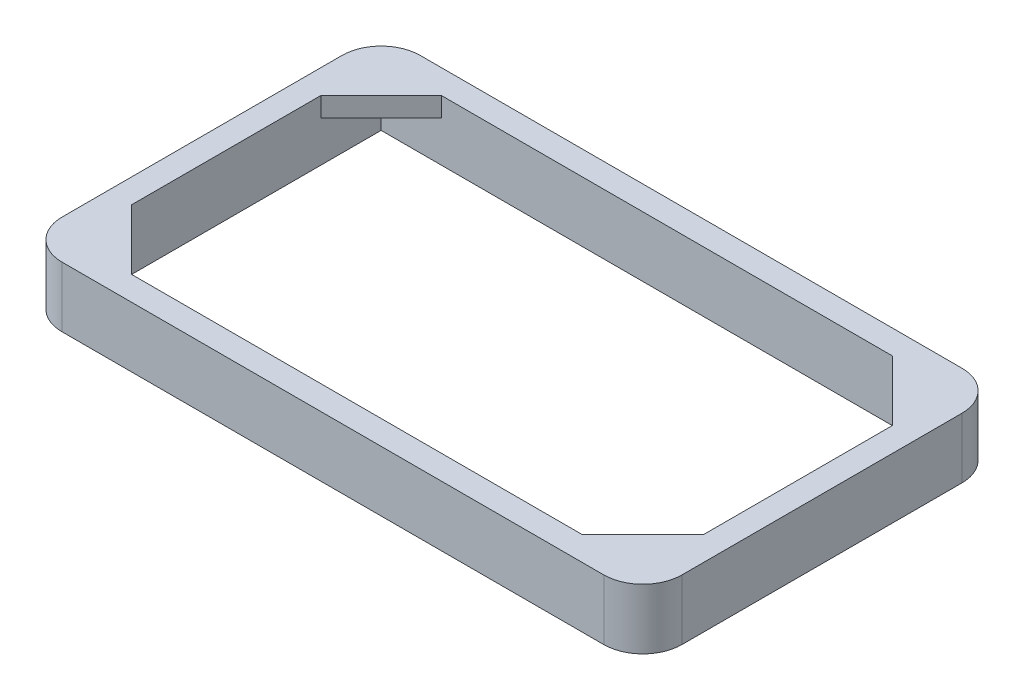
ISO-10303-21;
HEADER;
FILE_DESCRIPTION(('STEP AP214'),'2;1');
FILE_NAME('part.step','',(''),(''),'','','');
FILE_SCHEMA(('AUTOMOTIVE_DESIGN { 1 0 10303 214 1 1 1 1 }'));
ENDSEC;
DATA;
#1=APPLICATION_CONTEXT('core data for automotive mechanical design processes');
#2=APPLICATION_PROTOCOL_DEFINITION('international standard','automotive_design',2000,#1);
#3=PRODUCT_CONTEXT('',#1,'mechanical');
#4=PRODUCT('Part','Part','',(#3));
#5=PRODUCT_RELATED_PRODUCT_CATEGORY('part','',(#4));
#6=PRODUCT_DEFINITION_FORMATION('','',#4);
#7=PRODUCT_DEFINITION_CONTEXT('part definition',#1,'design');
#8=PRODUCT_DEFINITION('design','',#6,#7);
#9=PRODUCT_DEFINITION_SHAPE('','',#8);
#10=(LENGTH_UNIT() NAMED_UNIT(*) SI_UNIT(.MILLI.,.METRE.));
#11=(NAMED_UNIT(*) PLANE_ANGLE_UNIT() SI_UNIT($,.RADIAN.));
#12=(NAMED_UNIT(*) SI_UNIT($,.STERADIAN.) SOLID_ANGLE_UNIT());
#13=UNCERTAINTY_MEASURE_WITH_UNIT(LENGTH_MEASURE(1.E-05),#10,'distance_accuracy_value','');
#14=(GEOMETRIC_REPRESENTATION_CONTEXT(3) GLOBAL_UNCERTAINTY_ASSIGNED_CONTEXT((#13)) GLOBAL_UNIT_ASSIGNED_CONTEXT((#10,
#11,#12)) REPRESENTATION_CONTEXT('',''));
#15=CARTESIAN_POINT('',(0.,0.,0.));
#16=DIRECTION('',(0.,0.,1.));
#17=DIRECTION('',(1.,0.,0.));
#18=AXIS2_PLACEMENT_3D('',#15,#16,#17);
#19=CARTESIAN_POINT('',(0.,0.,0.));
#20=DIRECTION('',(0.,1.,0.));
#21=DIRECTION('',(0.,0.,1.));
#22=AXIS2_PLACEMENT_3D('',#19,#20,#21);
#23=PLANE('',#22);
#24=DIRECTION('',(0.,0.,-1.));
#25=VECTOR('',#24,1.);
#26=CARTESIAN_POINT('',(102.69,0.,-59.325));
#27=LINE('',#26,#25);
#28=CARTESIAN_POINT('',(102.69,0.,46.385));
#29=VERTEX_POINT('',#28);
#30=CARTESIAN_POINT('',(102.69,0.,-46.385));
#31=VERTEX_POINT('',#30);
#32=EDGE_CURVE('E327',#29,#31,#27,.T.);
#33=ORIENTED_EDGE('',*,*,#32,.F.);
#34=CARTESIAN_POINT('',(89.75,0.,46.385));
#35=DIRECTION('',(0.,1.,0.));
#36=DIRECTION('',(0.,0.,1.));
#37=AXIS2_PLACEMENT_3D('',#34,#35,#36);
#38=CIRCLE('',#37,12.94);
#39=CARTESIAN_POINT('',(89.75,0.,59.325));
#40=VERTEX_POINT('',#39);
#41=EDGE_CURVE('E358',#29,#40,#38,.F.);
#42=ORIENTED_EDGE('',*,*,#41,.T.);
#43=DIRECTION('',(1.,0.,0.));
#44=VECTOR('',#43,1.);
#45=CARTESIAN_POINT('',(-102.69,0.,59.325));
#46=LINE('',#45,#44);
#47=CARTESIAN_POINT('',(-89.75,0.,59.325));
#48=VERTEX_POINT('',#47);
#49=EDGE_CURVE('E338',#48,#40,#46,.T.);
#50=ORIENTED_EDGE('',*,*,#49,.F.);
#51=CARTESIAN_POINT('',(-89.75,0.,46.385));
#52=DIRECTION('',(0.,1.,0.));
#53=DIRECTION('',(0.,0.,1.));
#54=AXIS2_PLACEMENT_3D('',#51,#52,#53);
#55=CIRCLE('',#54,12.94);
#56=CARTESIAN_POINT('',(-102.69,0.,46.385));
#57=VERTEX_POINT('',#56);
#58=EDGE_CURVE('E352',#48,#57,#55,.F.);
#59=ORIENTED_EDGE('',*,*,#58,.T.);
#60=DIRECTION('',(0.,0.,1.));
#61=VECTOR('',#60,1.);
#62=CARTESIAN_POINT('',(-102.69,0.,-59.325));
#63=LINE('',#62,#61);
#64=CARTESIAN_POINT('',(-102.69,0.,-46.385));
#65=VERTEX_POINT('',#64);
#66=EDGE_CURVE('E334',#65,#57,#63,.T.);
#67=ORIENTED_EDGE('',*,*,#66,.F.);
#68=CARTESIAN_POINT('',(-89.7500000000001,0.,-46.385));
#69=DIRECTION('',(0.,1.,0.));
#70=DIRECTION('',(0.,0.,1.));
#71=AXIS2_PLACEMENT_3D('',#68,#69,#70);
#72=CIRCLE('',#71,12.94);
#73=CARTESIAN_POINT('',(-89.7500000000001,0.,-59.325));
#74=VERTEX_POINT('',#73);
#75=EDGE_CURVE('E349',#65,#74,#72,.F.);
#76=ORIENTED_EDGE('',*,*,#75,.T.);
#77=DIRECTION('',(-1.,0.,0.));
#78=VECTOR('',#77,1.);
#79=CARTESIAN_POINT('',(-102.69,0.,-59.325));
#80=LINE('',#79,#78);
#81=CARTESIAN_POINT('',(89.75,0.,-59.325));
#82=VERTEX_POINT('',#81);
#83=EDGE_CURVE('E331',#82,#74,#80,.T.);
#84=ORIENTED_EDGE('',*,*,#83,.F.);
#85=CARTESIAN_POINT('',(89.75,0.,-46.385));
#86=DIRECTION('',(0.,1.,0.));
#87=DIRECTION('',(0.,0.,1.));
#88=AXIS2_PLACEMENT_3D('',#85,#86,#87);
#89=CIRCLE('',#88,12.94);
#90=EDGE_CURVE('E355',#82,#31,#89,.F.);
#91=ORIENTED_EDGE('',*,*,#90,.T.);
#92=EDGE_LOOP('',(#33,#42,#50,#59,#67,#76,#84,#91));
#93=FACE_BOUND('',#92,.T.);
#94=DIRECTION('',(0.,0.,1.));
#95=VECTOR('',#94,1.);
#96=CARTESIAN_POINT('',(-94.69,0.,-51.325));
#97=LINE('',#96,#95);
#98=CARTESIAN_POINT('',(-94.69,0.,-51.325));
#99=VERTEX_POINT('',#98);
#100=CARTESIAN_POINT('',(-94.69,0.,51.325));
#101=VERTEX_POINT('',#100);
#102=EDGE_CURVE('E278',#99,#101,#97,.T.);
#103=ORIENTED_EDGE('',*,*,#102,.T.);
#104=DIRECTION('',(1.,0.,0.));
#105=VECTOR('',#104,1.);
#106=CARTESIAN_POINT('',(94.69,0.,51.325));
#107=LINE('',#106,#105);
#108=CARTESIAN_POINT('',(94.69,0.,51.325));
#109=VERTEX_POINT('',#108);
#110=EDGE_CURVE('E302',#101,#109,#107,.T.);
#111=ORIENTED_EDGE('',*,*,#110,.T.);
#112=DIRECTION('',(0.,0.,-1.));
#113=VECTOR('',#112,1.);
#114=CARTESIAN_POINT('',(94.69,0.,-51.325));
#115=LINE('',#114,#113);
#116=CARTESIAN_POINT('',(94.69,0.,-51.325));
#117=VERTEX_POINT('',#116);
#118=EDGE_CURVE('E306',#109,#117,#115,.T.);
#119=ORIENTED_EDGE('',*,*,#118,.T.);
#120=DIRECTION('',(-1.,0.,0.));
#121=VECTOR('',#120,1.);
#122=CARTESIAN_POINT('',(94.69,0.,-51.325));
#123=LINE('',#122,#121);
#124=EDGE_CURVE('E310',#117,#99,#123,.T.);
#125=ORIENTED_EDGE('',*,*,#124,.T.);
#126=EDGE_LOOP('',(#103,#111,#119,#125));
#127=FACE_BOUND('',#126,.T.);
#128=ADVANCED_FACE('F39',(#93,#127),#23,.F.);
#129=CARTESIAN_POINT('',(102.69,13.5,-59.325));
#130=DIRECTION('',(-1.,0.,0.));
#131=DIRECTION('',(0.,0.,1.));
#132=AXIS2_PLACEMENT_3D('',#129,#130,#131);
#133=PLANE('',#132);
#134=DIRECTION('',(0.,0.,-1.));
#135=VECTOR('',#134,1.);
#136=CARTESIAN_POINT('',(102.69,20.,-59.325));
#137=LINE('',#136,#135);
#138=CARTESIAN_POINT('',(102.69,20.,46.385));
#139=VERTEX_POINT('',#138);
#140=CARTESIAN_POINT('',(102.69,20.,-46.385));
#141=VERTEX_POINT('',#140);
#142=EDGE_CURVE('E272',#139,#141,#137,.T.);
#143=ORIENTED_EDGE('',*,*,#142,.F.);
#144=DIRECTION('',(0.,-1.,0.));
#145=VECTOR('',#144,1.);
#146=CARTESIAN_POINT('',(102.69,13.5,46.385));
#147=LINE('',#146,#145);
#148=EDGE_CURVE('E345',#139,#29,#147,.T.);
#149=ORIENTED_EDGE('',*,*,#148,.T.);
#150=ORIENTED_EDGE('',*,*,#32,.T.);
#151=DIRECTION('',(0.,-1.,0.));
#152=VECTOR('',#151,1.);
#153=CARTESIAN_POINT('',(102.69,13.5,-46.385));
#154=LINE('',#153,#152);
#155=EDGE_CURVE('E342',#31,#141,#154,.F.);
#156=ORIENTED_EDGE('',*,*,#155,.T.);
#157=EDGE_LOOP('',(#143,#149,#150,#156));
#158=FACE_BOUND('',#157,.T.);
#159=ADVANCED_FACE('F413',(#158),#133,.F.);
#160=CARTESIAN_POINT('',(-102.69,13.5,-59.325));
#161=DIRECTION('',(0.,0.,1.));
#162=DIRECTION('',(1.,0.,0.));
#163=AXIS2_PLACEMENT_3D('',#160,#161,#162);
#164=PLANE('',#163);
#165=DIRECTION('',(-1.,0.,0.));
#166=VECTOR('',#165,1.);
#167=CARTESIAN_POINT('',(-102.69,20.,-59.325));
#168=LINE('',#167,#166);
#169=CARTESIAN_POINT('',(89.75,20.,-59.325));
#170=VERTEX_POINT('',#169);
#171=CARTESIAN_POINT('',(-89.7500000000001,20.,-59.325));
#172=VERTEX_POINT('',#171);
#173=EDGE_CURVE('E275',#170,#172,#168,.T.);
#174=ORIENTED_EDGE('',*,*,#173,.F.);
#175=DIRECTION('',(0.,-1.,0.));
#176=VECTOR('',#175,1.);
#177=CARTESIAN_POINT('',(89.75,13.5,-59.325));
#178=LINE('',#177,#176);
#179=EDGE_CURVE('E381',#170,#82,#178,.T.);
#180=ORIENTED_EDGE('',*,*,#179,.T.);
#181=ORIENTED_EDGE('',*,*,#83,.T.);
#182=DIRECTION('',(0.,-1.,0.));
#183=VECTOR('',#182,1.);
#184=CARTESIAN_POINT('',(-89.7500000000001,13.5,-59.325));
#185=LINE('',#184,#183);
#186=EDGE_CURVE('E55',#74,#172,#185,.F.);
#187=ORIENTED_EDGE('',*,*,#186,.T.);
#188=EDGE_LOOP('',(#174,#180,#181,#187));
#189=FACE_BOUND('',#188,.T.);
#190=ADVANCED_FACE('F418',(#189),#164,.F.);
#191=CARTESIAN_POINT('',(-102.69,13.5,-59.325));
#192=DIRECTION('',(1.,0.,0.));
#193=DIRECTION('',(0.,0.,-1.));
#194=AXIS2_PLACEMENT_3D('',#191,#192,#193);
#195=PLANE('',#194);
#196=ORIENTED_EDGE('',*,*,#66,.T.);
#197=DIRECTION('',(0.,-1.,0.));
#198=VECTOR('',#197,1.);
#199=CARTESIAN_POINT('',(-102.69,13.5,46.385));
#200=LINE('',#199,#198);
#201=CARTESIAN_POINT('',(-102.69,20.,46.385));
#202=VERTEX_POINT('',#201);
#203=EDGE_CURVE('E11',#57,#202,#200,.F.);
#204=ORIENTED_EDGE('',*,*,#203,.T.);
#205=DIRECTION('',(0.,0.,1.));
#206=VECTOR('',#205,1.);
#207=CARTESIAN_POINT('',(-102.69,20.,-59.325));
#208=LINE('',#207,#206);
#209=CARTESIAN_POINT('',(-102.69,20.,-46.385));
#210=VERTEX_POINT('',#209);
#211=EDGE_CURVE('E200',#210,#202,#208,.T.);
#212=ORIENTED_EDGE('',*,*,#211,.F.);
#213=DIRECTION('',(0.,-1.,0.));
#214=VECTOR('',#213,1.);
#215=CARTESIAN_POINT('',(-102.69,13.5,-46.385));
#216=LINE('',#215,#214);
#217=EDGE_CURVE('E48',#210,#65,#216,.T.);
#218=ORIENTED_EDGE('',*,*,#217,.T.);
#219=EDGE_LOOP('',(#196,#204,#212,#218));
#220=FACE_BOUND('',#219,.T.);
#221=ADVANCED_FACE('F390',(#220),#195,.F.);
#222=CARTESIAN_POINT('',(-102.69,13.5,59.325));
#223=DIRECTION('',(0.,0.,-1.));
#224=DIRECTION('',(-1.,0.,0.));
#225=AXIS2_PLACEMENT_3D('',#222,#223,#224);
#226=PLANE('',#225);
#227=ORIENTED_EDGE('',*,*,#49,.T.);
#228=DIRECTION('',(0.,-1.,0.));
#229=VECTOR('',#228,1.);
#230=CARTESIAN_POINT('',(89.75,13.5,59.325));
#231=LINE('',#230,#229);
#232=CARTESIAN_POINT('',(89.75,20.,59.325));
#233=VERTEX_POINT('',#232);
#234=EDGE_CURVE('E365',#40,#233,#231,.F.);
#235=ORIENTED_EDGE('',*,*,#234,.T.);
#236=DIRECTION('',(1.,0.,0.));
#237=VECTOR('',#236,1.);
#238=CARTESIAN_POINT('',(-102.69,20.,59.325));
#239=LINE('',#238,#237);
#240=CARTESIAN_POINT('',(-89.75,20.,59.325));
#241=VERTEX_POINT('',#240);
#242=EDGE_CURVE('E268',#241,#233,#239,.T.);
#243=ORIENTED_EDGE('',*,*,#242,.F.);
#244=DIRECTION('',(0.,-1.,0.));
#245=VECTOR('',#244,1.);
#246=CARTESIAN_POINT('',(-89.75,13.5,59.325));
#247=LINE('',#246,#245);
#248=EDGE_CURVE('E361',#241,#48,#247,.T.);
#249=ORIENTED_EDGE('',*,*,#248,.T.);
#250=EDGE_LOOP('',(#227,#235,#243,#249));
#251=FACE_BOUND('',#250,.T.);
#252=ADVANCED_FACE('F405',(#251),#226,.F.);
#253=CARTESIAN_POINT('',(-94.69,13.5,-51.325));
#254=DIRECTION('',(1.,0.,0.));
#255=DIRECTION('',(0.,0.,-1.));
#256=AXIS2_PLACEMENT_3D('',#253,#254,#255);
#257=PLANE('',#256);
#258=ORIENTED_EDGE('',*,*,#102,.F.);
#259=DIRECTION('',(0.,-1.,0.));
#260=VECTOR('',#259,1.);
#261=CARTESIAN_POINT('',(-94.69,13.5,-51.325));
#262=LINE('',#261,#260);
#263=CARTESIAN_POINT('',(-94.69,13.5,-51.325));
#264=VERTEX_POINT('',#263);
#265=EDGE_CURVE('E298',#264,#99,#262,.T.);
#266=ORIENTED_EDGE('',*,*,#265,.F.);
#267=DIRECTION('',(0.,0.,1.));
#268=VECTOR('',#267,1.);
#269=CARTESIAN_POINT('',(-94.69,13.5,-51.325));
#270=LINE('',#269,#268);
#271=CARTESIAN_POINT('',(-94.69,13.5,-31.325));
#272=VERTEX_POINT('',#271);
#273=EDGE_CURVE('E279',#264,#272,#270,.T.);
#274=ORIENTED_EDGE('',*,*,#273,.T.);
#275=DIRECTION('',(0.,-1.,0.));
#276=VECTOR('',#275,1.);
#277=CARTESIAN_POINT('',(-94.69,20.,-31.325));
#278=LINE('',#277,#276);
#279=CARTESIAN_POINT('',(-94.69,20.,-31.325));
#280=VERTEX_POINT('',#279);
#281=EDGE_CURVE('E185',#280,#272,#278,.T.);
#282=ORIENTED_EDGE('',*,*,#281,.F.);
#283=DIRECTION('',(0.,0.,1.));
#284=VECTOR('',#283,1.);
#285=CARTESIAN_POINT('',(-94.69,20.,-31.325));
#286=LINE('',#285,#284);
#287=CARTESIAN_POINT('',(-94.69,20.,31.325));
#288=VERTEX_POINT('',#287);
#289=EDGE_CURVE('E179',#280,#288,#286,.T.);
#290=ORIENTED_EDGE('',*,*,#289,.T.);
#291=DIRECTION('',(0.,-1.,0.));
#292=VECTOR('',#291,1.);
#293=CARTESIAN_POINT('',(-94.69,20.,31.325));
#294=LINE('',#293,#292);
#295=CARTESIAN_POINT('',(-94.69,13.5,31.325));
#296=VERTEX_POINT('',#295);
#297=EDGE_CURVE('E183',#288,#296,#294,.T.);
#298=ORIENTED_EDGE('',*,*,#297,.T.);
#299=CARTESIAN_POINT('',(-94.69,13.5,51.325));
#300=VERTEX_POINT('',#299);
#301=EDGE_CURVE('E283',#296,#300,#270,.T.);
#302=ORIENTED_EDGE('',*,*,#301,.T.);
#303=DIRECTION('',(0.,-1.,0.));
#304=VECTOR('',#303,1.);
#305=CARTESIAN_POINT('',(-94.69,13.5,51.325));
#306=LINE('',#305,#304);
#307=EDGE_CURVE('E323',#300,#101,#306,.T.);
#308=ORIENTED_EDGE('',*,*,#307,.T.);
#309=EDGE_LOOP('',(#258,#266,#274,#282,#290,#298,#302,#308));
#310=FACE_BOUND('',#309,.T.);
#311=ADVANCED_FACE('F181',(#310),#257,.T.);
#312=CARTESIAN_POINT('',(94.69,13.5,51.325));
#313=DIRECTION('',(0.,0.,-1.));
#314=DIRECTION('',(-1.,0.,0.));
#315=AXIS2_PLACEMENT_3D('',#312,#313,#314);
#316=PLANE('',#315);
#317=ORIENTED_EDGE('',*,*,#110,.F.);
#318=ORIENTED_EDGE('',*,*,#307,.F.);
#319=DIRECTION('',(1.,0.,0.));
#320=VECTOR('',#319,1.);
#321=CARTESIAN_POINT('',(94.69,13.5,51.325));
#322=LINE('',#321,#320);
#323=CARTESIAN_POINT('',(-74.69,13.5,51.325));
#324=VERTEX_POINT('',#323);
#325=EDGE_CURVE('E284',#300,#324,#322,.T.);
#326=ORIENTED_EDGE('',*,*,#325,.T.);
#327=DIRECTION('',(0.,-1.,0.));
#328=VECTOR('',#327,1.);
#329=CARTESIAN_POINT('',(-74.69,20.,51.325));
#330=LINE('',#329,#328);
#331=CARTESIAN_POINT('',(-74.69,20.,51.325));
#332=VERTEX_POINT('',#331);
#333=EDGE_CURVE('E201',#332,#324,#330,.T.);
#334=ORIENTED_EDGE('',*,*,#333,.F.);
#335=DIRECTION('',(1.,0.,0.));
#336=VECTOR('',#335,1.);
#337=CARTESIAN_POINT('',(-74.69,20.,51.325));
#338=LINE('',#337,#336);
#339=CARTESIAN_POINT('',(74.69,20.,51.325));
#340=VERTEX_POINT('',#339);
#341=EDGE_CURVE('E206',#332,#340,#338,.T.);
#342=ORIENTED_EDGE('',*,*,#341,.T.);
#343=DIRECTION('',(0.,-1.,0.));
#344=VECTOR('',#343,1.);
#345=CARTESIAN_POINT('',(74.69,20.,51.325));
#346=LINE('',#345,#344);
#347=CARTESIAN_POINT('',(74.69,13.5,51.325));
#348=VERTEX_POINT('',#347);
#349=EDGE_CURVE('E259',#340,#348,#346,.T.);
#350=ORIENTED_EDGE('',*,*,#349,.T.);
#351=CARTESIAN_POINT('',(94.69,13.5,51.325));
#352=VERTEX_POINT('',#351);
#353=EDGE_CURVE('E282',#348,#352,#322,.T.);
#354=ORIENTED_EDGE('',*,*,#353,.T.);
#355=DIRECTION('',(0.,-1.,0.));
#356=VECTOR('',#355,1.);
#357=CARTESIAN_POINT('',(94.69,13.5,51.325));
#358=LINE('',#357,#356);
#359=EDGE_CURVE('E320',#352,#109,#358,.T.);
#360=ORIENTED_EDGE('',*,*,#359,.T.);
#361=EDGE_LOOP('',(#317,#318,#326,#334,#342,#350,#354,#360));
#362=FACE_BOUND('',#361,.T.);
#363=ADVANCED_FACE('F631',(#362),#316,.T.);
#364=CARTESIAN_POINT('',(94.69,13.5,-51.325));
#365=DIRECTION('',(-1.,0.,0.));
#366=DIRECTION('',(0.,0.,1.));
#367=AXIS2_PLACEMENT_3D('',#364,#365,#366);
#368=PLANE('',#367);
#369=ORIENTED_EDGE('',*,*,#118,.F.);
#370=ORIENTED_EDGE('',*,*,#359,.F.);
#371=DIRECTION('',(0.,0.,-1.));
#372=VECTOR('',#371,1.);
#373=CARTESIAN_POINT('',(94.69,13.5,-51.325));
#374=LINE('',#373,#372);
#375=CARTESIAN_POINT('',(94.69,13.5,31.325));
#376=VERTEX_POINT('',#375);
#377=EDGE_CURVE('E289',#352,#376,#374,.T.);
#378=ORIENTED_EDGE('',*,*,#377,.T.);
#379=DIRECTION('',(0.,-1.,0.));
#380=VECTOR('',#379,1.);
#381=CARTESIAN_POINT('',(94.69,20.,31.325));
#382=LINE('',#381,#380);
#383=CARTESIAN_POINT('',(94.69,20.,31.325));
#384=VERTEX_POINT('',#383);
#385=EDGE_CURVE('E256',#384,#376,#382,.T.);
#386=ORIENTED_EDGE('',*,*,#385,.F.);
#387=DIRECTION('',(0.,0.,-1.));
#388=VECTOR('',#387,1.);
#389=CARTESIAN_POINT('',(94.69,20.,-31.3249999999999));
#390=LINE('',#389,#388);
#391=CARTESIAN_POINT('',(94.69,20.,-31.3249999999999));
#392=VERTEX_POINT('',#391);
#393=EDGE_CURVE('E216',#384,#392,#390,.T.);
#394=ORIENTED_EDGE('',*,*,#393,.T.);
#395=DIRECTION('',(0.,-1.,0.));
#396=VECTOR('',#395,1.);
#397=CARTESIAN_POINT('',(94.69,20.,-31.3249999999999));
#398=LINE('',#397,#396);
#399=CARTESIAN_POINT('',(94.69,13.5,-31.3249999999999));
#400=VERTEX_POINT('',#399);
#401=EDGE_CURVE('E252',#392,#400,#398,.T.);
#402=ORIENTED_EDGE('',*,*,#401,.T.);
#403=CARTESIAN_POINT('',(94.69,13.5,-51.325));
#404=VERTEX_POINT('',#403);
#405=EDGE_CURVE('E288',#400,#404,#374,.T.);
#406=ORIENTED_EDGE('',*,*,#405,.T.);
#407=DIRECTION('',(0.,-1.,0.));
#408=VECTOR('',#407,1.);
#409=CARTESIAN_POINT('',(94.69,13.5,-51.325));
#410=LINE('',#409,#408);
#411=EDGE_CURVE('E317',#404,#117,#410,.T.);
#412=ORIENTED_EDGE('',*,*,#411,.T.);
#413=EDGE_LOOP('',(#369,#370,#378,#386,#394,#402,#406,#412));
#414=FACE_BOUND('',#413,.T.);
#415=ADVANCED_FACE('F618',(#414),#368,.T.);
#416=CARTESIAN_POINT('',(94.69,13.5,-51.325));
#417=DIRECTION('',(0.,0.,1.));
#418=DIRECTION('',(1.,0.,0.));
#419=AXIS2_PLACEMENT_3D('',#416,#417,#418);
#420=PLANE('',#419);
#421=ORIENTED_EDGE('',*,*,#124,.F.);
#422=ORIENTED_EDGE('',*,*,#411,.F.);
#423=DIRECTION('',(-1.,0.,0.));
#424=VECTOR('',#423,1.);
#425=CARTESIAN_POINT('',(94.69,13.5,-51.325));
#426=LINE('',#425,#424);
#427=CARTESIAN_POINT('',(74.69,13.5,-51.325));
#428=VERTEX_POINT('',#427);
#429=EDGE_CURVE('E294',#404,#428,#426,.T.);
#430=ORIENTED_EDGE('',*,*,#429,.T.);
#431=DIRECTION('',(0.,-1.,0.));
#432=VECTOR('',#431,1.);
#433=CARTESIAN_POINT('',(74.69,20.,-51.325));
#434=LINE('',#433,#432);
#435=CARTESIAN_POINT('',(74.69,20.,-51.325));
#436=VERTEX_POINT('',#435);
#437=EDGE_CURVE('E249',#436,#428,#434,.T.);
#438=ORIENTED_EDGE('',*,*,#437,.F.);
#439=DIRECTION('',(-1.,0.,0.));
#440=VECTOR('',#439,1.);
#441=CARTESIAN_POINT('',(-74.69,20.,-51.325));
#442=LINE('',#441,#440);
#443=CARTESIAN_POINT('',(-74.69,20.,-51.325));
#444=VERTEX_POINT('',#443);
#445=EDGE_CURVE('E222',#436,#444,#442,.T.);
#446=ORIENTED_EDGE('',*,*,#445,.T.);
#447=DIRECTION('',(0.,-1.,0.));
#448=VECTOR('',#447,1.);
#449=CARTESIAN_POINT('',(-74.69,20.,-51.325));
#450=LINE('',#449,#448);
#451=CARTESIAN_POINT('',(-74.69,13.5,-51.325));
#452=VERTEX_POINT('',#451);
#453=EDGE_CURVE('E245',#444,#452,#450,.T.);
#454=ORIENTED_EDGE('',*,*,#453,.T.);
#455=EDGE_CURVE('E293',#452,#264,#426,.T.);
#456=ORIENTED_EDGE('',*,*,#455,.T.);
#457=ORIENTED_EDGE('',*,*,#265,.T.);
#458=EDGE_LOOP('',(#421,#422,#430,#438,#446,#454,#456,#457));
#459=FACE_BOUND('',#458,.T.);
#460=ADVANCED_FACE('F610',(#459),#420,.T.);
#461=CARTESIAN_POINT('',(0.,13.5,0.));
#462=DIRECTION('',(0.,1.,0.));
#463=DIRECTION('',(0.,0.,1.));
#464=AXIS2_PLACEMENT_3D('',#461,#462,#463);
#465=PLANE('',#464);
#466=CARTESIAN_POINT('',(-88.94,13.5,45.575));
#467=DIRECTION('',(0.,-1.,0.));
#468=DIRECTION('',(0.,0.,-1.));
#469=AXIS2_PLACEMENT_3D('',#466,#467,#468);
#470=CIRCLE('',#469,2.5);
#471=CARTESIAN_POINT('',(-88.94,13.5,43.075));
#472=VERTEX_POINT('',#471);
#473=EDGE_CURVE('E743',#472,#472,#470,.T.);
#474=ORIENTED_EDGE('',*,*,#473,.F.);
#475=EDGE_LOOP('',(#474));
#476=FACE_BOUND('',#475,.T.);
#477=ORIENTED_EDGE('',*,*,#325,.F.);
#478=ORIENTED_EDGE('',*,*,#301,.F.);
#479=DIRECTION('',(0.707106781186548,0.,0.707106781186547));
#480=VECTOR('',#479,1.);
#481=CARTESIAN_POINT('',(-94.69,13.5,31.325));
#482=LINE('',#481,#480);
#483=EDGE_CURVE('E198',#296,#324,#482,.T.);
#484=ORIENTED_EDGE('',*,*,#483,.T.);
#485=EDGE_LOOP('',(#477,#478,#484));
#486=FACE_BOUND('',#485,.T.);
#487=ADVANCED_FACE('F581',(#476,#486),#465,.F.);
#488=CARTESIAN_POINT('',(-88.94,13.5,-45.575));
#489=DIRECTION('',(0.,-1.,0.));
#490=DIRECTION('',(0.,0.,1.));
#491=AXIS2_PLACEMENT_3D('',#488,#489,#490);
#492=CIRCLE('',#491,2.5);
#493=CARTESIAN_POINT('',(-88.94,13.5,-43.075));
#494=VERTEX_POINT('',#493);
#495=EDGE_CURVE('E755',#494,#494,#492,.T.);
#496=ORIENTED_EDGE('',*,*,#495,.F.);
#497=EDGE_LOOP('',(#496));
#498=FACE_BOUND('',#497,.T.);
#499=ORIENTED_EDGE('',*,*,#273,.F.);
#500=ORIENTED_EDGE('',*,*,#455,.F.);
#501=DIRECTION('',(-0.707106781186548,0.,0.707106781186547));
#502=VECTOR('',#501,1.);
#503=CARTESIAN_POINT('',(-94.69,13.5,-31.325));
#504=LINE('',#503,#502);
#505=EDGE_CURVE('E191',#452,#272,#504,.T.);
#506=ORIENTED_EDGE('',*,*,#505,.T.);
#507=EDGE_LOOP('',(#499,#500,#506));
#508=FACE_BOUND('',#507,.T.);
#509=ADVANCED_FACE('F596',(#498,#508),#465,.F.);
#510=CARTESIAN_POINT('',(88.94,13.5,45.575));
#511=DIRECTION('',(0.,-1.,0.));
#512=DIRECTION('',(0.,0.,1.));
#513=AXIS2_PLACEMENT_3D('',#510,#511,#512);
#514=CIRCLE('',#513,2.5);
#515=CARTESIAN_POINT('',(88.94,13.5,48.075));
#516=VERTEX_POINT('',#515);
#517=EDGE_CURVE('E752',#516,#516,#514,.T.);
#518=ORIENTED_EDGE('',*,*,#517,.F.);
#519=EDGE_LOOP('',(#518));
#520=FACE_BOUND('',#519,.T.);
#521=ORIENTED_EDGE('',*,*,#353,.F.);
#522=DIRECTION('',(0.707106781186548,0.,-0.707106781186548));
#523=VECTOR('',#522,1.);
#524=CARTESIAN_POINT('',(94.69,13.5,31.325));
#525=LINE('',#524,#523);
#526=EDGE_CURVE('E231',#348,#376,#525,.T.);
#527=ORIENTED_EDGE('',*,*,#526,.T.);
#528=ORIENTED_EDGE('',*,*,#377,.F.);
#529=EDGE_LOOP('',(#521,#527,#528));
#530=FACE_BOUND('',#529,.T.);
#531=ADVANCED_FACE('F582',(#520,#530),#465,.F.);
#532=CARTESIAN_POINT('',(0.,20.,0.));
#533=DIRECTION('',(0.,1.,0.));
#534=DIRECTION('',(0.,0.,1.));
#535=AXIS2_PLACEMENT_3D('',#532,#533,#534);
#536=PLANE('',#535);
#537=ORIENTED_EDGE('',*,*,#242,.T.);
#538=CARTESIAN_POINT('',(89.75,20.,46.385));
#539=DIRECTION('',(0.,1.,0.));
#540=DIRECTION('',(0.,0.,1.));
#541=AXIS2_PLACEMENT_3D('',#538,#539,#540);
#542=CIRCLE('',#541,12.94);
#543=EDGE_CURVE('E376',#233,#139,#542,.T.);
#544=ORIENTED_EDGE('',*,*,#543,.T.);
#545=ORIENTED_EDGE('',*,*,#142,.T.);
#546=CARTESIAN_POINT('',(89.75,20.,-46.385));
#547=DIRECTION('',(0.,1.,0.));
#548=DIRECTION('',(0.,0.,1.));
#549=AXIS2_PLACEMENT_3D('',#546,#547,#548);
#550=CIRCLE('',#549,12.94);
#551=EDGE_CURVE('E62',#141,#170,#550,.T.);
#552=ORIENTED_EDGE('',*,*,#551,.T.);
#553=ORIENTED_EDGE('',*,*,#173,.T.);
#554=CARTESIAN_POINT('',(-89.7500000000001,20.,-46.385));
#555=DIRECTION('',(0.,1.,0.));
#556=DIRECTION('',(0.,0.,1.));
#557=AXIS2_PLACEMENT_3D('',#554,#555,#556);
#558=CIRCLE('',#557,12.94);
#559=EDGE_CURVE('E368',#172,#210,#558,.T.);
#560=ORIENTED_EDGE('',*,*,#559,.T.);
#561=ORIENTED_EDGE('',*,*,#211,.T.);
#562=CARTESIAN_POINT('',(-89.75,20.,46.385));
#563=DIRECTION('',(0.,1.,0.));
#564=DIRECTION('',(0.,0.,1.));
#565=AXIS2_PLACEMENT_3D('',#562,#563,#564);
#566=CIRCLE('',#565,12.94);
#567=EDGE_CURVE('E371',#202,#241,#566,.T.);
#568=ORIENTED_EDGE('',*,*,#567,.T.);
#569=EDGE_LOOP('',(#537,#544,#545,#552,#553,#560,#561,#568));
#570=FACE_BOUND('',#569,.T.);
#571=DIRECTION('',(0.707106781186548,0.,0.707106781186547));
#572=VECTOR('',#571,1.);
#573=CARTESIAN_POINT('',(-94.69,20.,31.325));
#574=LINE('',#573,#572);
#575=EDGE_CURVE('E190',#288,#332,#574,.T.);
#576=ORIENTED_EDGE('',*,*,#575,.F.);
#577=ORIENTED_EDGE('',*,*,#289,.F.);
#578=DIRECTION('',(-0.707106781186548,0.,0.707106781186547));
#579=VECTOR('',#578,1.);
#580=CARTESIAN_POINT('',(-94.69,20.,-31.325));
#581=LINE('',#580,#579);
#582=EDGE_CURVE('E226',#444,#280,#581,.T.);
#583=ORIENTED_EDGE('',*,*,#582,.F.);
#584=ORIENTED_EDGE('',*,*,#445,.F.);
#585=DIRECTION('',(-0.707106781186548,0.,-0.707106781186548));
#586=VECTOR('',#585,1.);
#587=CARTESIAN_POINT('',(94.69,20.,-31.3249999999999));
#588=LINE('',#587,#586);
#589=EDGE_CURVE('E219',#392,#436,#588,.T.);
#590=ORIENTED_EDGE('',*,*,#589,.F.);
#591=ORIENTED_EDGE('',*,*,#393,.F.);
#592=DIRECTION('',(0.707106781186548,0.,-0.707106781186548));
#593=VECTOR('',#592,1.);
#594=CARTESIAN_POINT('',(94.69,20.,31.325));
#595=LINE('',#594,#593);
#596=EDGE_CURVE('E210',#340,#384,#595,.T.);
#597=ORIENTED_EDGE('',*,*,#596,.F.);
#598=ORIENTED_EDGE('',*,*,#341,.F.);
#599=EDGE_LOOP('',(#576,#577,#583,#584,#590,#591,#597,#598));
#600=FACE_BOUND('',#599,.T.);
#601=ADVANCED_FACE('F204',(#570,#600),#536,.T.);
#602=CARTESIAN_POINT('',(88.94,13.5,-45.575));
#603=DIRECTION('',(0.,-1.,0.));
#604=DIRECTION('',(0.,0.,-1.));
#605=AXIS2_PLACEMENT_3D('',#602,#603,#604);
#606=CIRCLE('',#605,2.5);
#607=CARTESIAN_POINT('',(88.94,13.5,-48.075));
#608=VERTEX_POINT('',#607);
#609=EDGE_CURVE('E763',#608,#608,#606,.T.);
#610=ORIENTED_EDGE('',*,*,#609,.F.);
#611=EDGE_LOOP('',(#610));
#612=FACE_BOUND('',#611,.T.);
#613=ORIENTED_EDGE('',*,*,#429,.F.);
#614=ORIENTED_EDGE('',*,*,#405,.F.);
#615=DIRECTION('',(-0.707106781186548,0.,-0.707106781186548));
#616=VECTOR('',#615,1.);
#617=CARTESIAN_POINT('',(94.69,13.5,-31.3249999999999));
#618=LINE('',#617,#616);
#619=EDGE_CURVE('E236',#400,#428,#618,.T.);
#620=ORIENTED_EDGE('',*,*,#619,.T.);
#621=EDGE_LOOP('',(#613,#614,#620));
#622=FACE_BOUND('',#621,.T.);
#623=ADVANCED_FACE('F571',(#612,#622),#465,.F.);
#624=CARTESIAN_POINT('',(-94.69,20.,31.325));
#625=DIRECTION('',(0.707106781186547,0.,-0.707106781186548));
#626=DIRECTION('',(-0.707106781186548,0.,-0.707106781186547));
#627=AXIS2_PLACEMENT_3D('',#624,#625,#626);
#628=PLANE('',#627);
#629=ORIENTED_EDGE('',*,*,#483,.F.);
#630=ORIENTED_EDGE('',*,*,#297,.F.);
#631=ORIENTED_EDGE('',*,*,#575,.T.);
#632=ORIENTED_EDGE('',*,*,#333,.T.);
#633=EDGE_LOOP('',(#629,#630,#631,#632));
#634=FACE_BOUND('',#633,.T.);
#635=ADVANCED_FACE('F195',(#634),#628,.T.);
#636=CARTESIAN_POINT('',(94.69,20.,31.325));
#637=DIRECTION('',(-0.707106781186548,0.,-0.707106781186548));
#638=DIRECTION('',(-0.707106781186548,0.,0.707106781186548));
#639=AXIS2_PLACEMENT_3D('',#636,#637,#638);
#640=PLANE('',#639);
#641=ORIENTED_EDGE('',*,*,#526,.F.);
#642=ORIENTED_EDGE('',*,*,#349,.F.);
#643=ORIENTED_EDGE('',*,*,#596,.T.);
#644=ORIENTED_EDGE('',*,*,#385,.T.);
#645=EDGE_LOOP('',(#641,#642,#643,#644));
#646=FACE_BOUND('',#645,.T.);
#647=ADVANCED_FACE('F554',(#646),#640,.T.);
#648=CARTESIAN_POINT('',(94.69,20.,-31.3249999999999));
#649=DIRECTION('',(-0.707106781186548,0.,0.707106781186548));
#650=DIRECTION('',(0.707106781186548,0.,0.707106781186548));
#651=AXIS2_PLACEMENT_3D('',#648,#649,#650);
#652=PLANE('',#651);
#653=ORIENTED_EDGE('',*,*,#619,.F.);
#654=ORIENTED_EDGE('',*,*,#401,.F.);
#655=ORIENTED_EDGE('',*,*,#589,.T.);
#656=ORIENTED_EDGE('',*,*,#437,.T.);
#657=EDGE_LOOP('',(#653,#654,#655,#656));
#658=FACE_BOUND('',#657,.T.);
#659=ADVANCED_FACE('F544',(#658),#652,.T.);
#660=CARTESIAN_POINT('',(-94.69,20.,-31.325));
#661=DIRECTION('',(0.707106781186547,0.,0.707106781186548));
#662=DIRECTION('',(0.707106781186548,0.,-0.707106781186547));
#663=AXIS2_PLACEMENT_3D('',#660,#661,#662);
#664=PLANE('',#663);
#665=ORIENTED_EDGE('',*,*,#505,.F.);
#666=ORIENTED_EDGE('',*,*,#453,.F.);
#667=ORIENTED_EDGE('',*,*,#582,.T.);
#668=ORIENTED_EDGE('',*,*,#281,.T.);
#669=EDGE_LOOP('',(#665,#666,#667,#668));
#670=FACE_BOUND('',#669,.T.);
#671=ADVANCED_FACE('F534',(#670),#664,.T.);
#672=CARTESIAN_POINT('',(88.94,19.5,-45.575));
#673=DIRECTION('',(0.,-1.,0.));
#674=DIRECTION('',(0.,0.,-1.));
#675=AXIS2_PLACEMENT_3D('',#672,#673,#674);
#676=CYLINDRICAL_SURFACE('',#675,2.5);
#677=CARTESIAN_POINT('',(88.94,19.5,-45.575));
#678=DIRECTION('',(0.,-1.,0.));
#679=DIRECTION('',(0.,0.,-1.));
#680=AXIS2_PLACEMENT_3D('',#677,#678,#679);
#681=CIRCLE('',#680,2.5);
#682=CARTESIAN_POINT('',(88.94,19.5,-48.075));
#683=VERTEX_POINT('',#682);
#684=EDGE_CURVE('E767',#683,#683,#681,.T.);
#685=ORIENTED_EDGE('',*,*,#684,.F.);
#686=EDGE_LOOP('',(#685));
#687=FACE_BOUND('',#686,.T.);
#688=ORIENTED_EDGE('',*,*,#609,.T.);
#689=EDGE_LOOP('',(#688));
#690=FACE_BOUND('',#689,.T.);
#691=ADVANCED_FACE('F525',(#687,#690),#676,.F.);
#692=CARTESIAN_POINT('',(88.94,19.5,-45.575));
#693=DIRECTION('',(0.,-1.,0.));
#694=DIRECTION('',(0.,0.,-1.));
#695=AXIS2_PLACEMENT_3D('',#692,#693,#694);
#696=PLANE('',#695);
#697=ORIENTED_EDGE('',*,*,#684,.T.);
#698=EDGE_LOOP('',(#697));
#699=FACE_BOUND('',#698,.T.);
#700=ADVANCED_FACE('F516',(#699),#696,.T.);
#701=CARTESIAN_POINT('',(88.94,19.5,45.575));
#702=DIRECTION('',(0.,-1.,0.));
#703=DIRECTION('',(0.,0.,-1.));
#704=AXIS2_PLACEMENT_3D('',#701,#702,#703);
#705=CYLINDRICAL_SURFACE('',#704,2.5);
#706=CARTESIAN_POINT('',(88.94,19.5,45.575));
#707=DIRECTION('',(0.,-1.,0.));
#708=DIRECTION('',(0.,0.,1.));
#709=AXIS2_PLACEMENT_3D('',#706,#707,#708);
#710=CIRCLE('',#709,2.5);
#711=CARTESIAN_POINT('',(88.94,19.5,48.075));
#712=VERTEX_POINT('',#711);
#713=EDGE_CURVE('E746',#712,#712,#710,.T.);
#714=ORIENTED_EDGE('',*,*,#713,.F.);
#715=EDGE_LOOP('',(#714));
#716=FACE_BOUND('',#715,.T.);
#717=ORIENTED_EDGE('',*,*,#517,.T.);
#718=EDGE_LOOP('',(#717));
#719=FACE_BOUND('',#718,.T.);
#720=ADVANCED_FACE('F507',(#716,#719),#705,.F.);
#721=CARTESIAN_POINT('',(88.94,19.5,45.575));
#722=DIRECTION('',(0.,1.,0.));
#723=DIRECTION('',(0.,0.,1.));
#724=AXIS2_PLACEMENT_3D('',#721,#722,#723);
#725=PLANE('',#724);
#726=ORIENTED_EDGE('',*,*,#713,.T.);
#727=EDGE_LOOP('',(#726));
#728=FACE_BOUND('',#727,.T.);
#729=ADVANCED_FACE('F498',(#728),#725,.F.);
#730=CARTESIAN_POINT('',(-88.94,19.5,-45.575));
#731=DIRECTION('',(0.,-1.,0.));
#732=DIRECTION('',(0.,0.,-1.));
#733=AXIS2_PLACEMENT_3D('',#730,#731,#732);
#734=CYLINDRICAL_SURFACE('',#733,2.5);
#735=CARTESIAN_POINT('',(-88.94,19.5,-45.575));
#736=DIRECTION('',(0.,-1.,0.));
#737=DIRECTION('',(0.,0.,1.));
#738=AXIS2_PLACEMENT_3D('',#735,#736,#737);
#739=CIRCLE('',#738,2.5);
#740=CARTESIAN_POINT('',(-88.94,19.5,-43.075));
#741=VERTEX_POINT('',#740);
#742=EDGE_CURVE('E759',#741,#741,#739,.T.);
#743=ORIENTED_EDGE('',*,*,#742,.F.);
#744=EDGE_LOOP('',(#743));
#745=FACE_BOUND('',#744,.T.);
#746=ORIENTED_EDGE('',*,*,#495,.T.);
#747=EDGE_LOOP('',(#746));
#748=FACE_BOUND('',#747,.T.);
#749=ADVANCED_FACE('F489',(#745,#748),#734,.F.);
#750=CARTESIAN_POINT('',(-88.94,19.5,-45.575));
#751=DIRECTION('',(0.,1.,0.));
#752=DIRECTION('',(0.,0.,1.));
#753=AXIS2_PLACEMENT_3D('',#750,#751,#752);
#754=PLANE('',#753);
#755=ORIENTED_EDGE('',*,*,#742,.T.);
#756=EDGE_LOOP('',(#755));
#757=FACE_BOUND('',#756,.T.);
#758=ADVANCED_FACE('F480',(#757),#754,.F.);
#759=CARTESIAN_POINT('',(-88.94,19.5,45.575));
#760=DIRECTION('',(0.,-1.,0.));
#761=DIRECTION('',(0.,0.,-1.));
#762=AXIS2_PLACEMENT_3D('',#759,#760,#761);
#763=CYLINDRICAL_SURFACE('',#762,2.5);
#764=CARTESIAN_POINT('',(-88.94,19.5,45.575));
#765=DIRECTION('',(0.,-1.,0.));
#766=DIRECTION('',(0.,0.,-1.));
#767=AXIS2_PLACEMENT_3D('',#764,#765,#766);
#768=CIRCLE('',#767,2.5);
#769=CARTESIAN_POINT('',(-88.94,19.5,43.075));
#770=VERTEX_POINT('',#769);
#771=EDGE_CURVE('E232',#770,#770,#768,.T.);
#772=ORIENTED_EDGE('',*,*,#771,.F.);
#773=EDGE_LOOP('',(#772));
#774=FACE_BOUND('',#773,.T.);
#775=ORIENTED_EDGE('',*,*,#473,.T.);
#776=EDGE_LOOP('',(#775));
#777=FACE_BOUND('',#776,.T.);
#778=ADVANCED_FACE('F471',(#774,#777),#763,.F.);
#779=CARTESIAN_POINT('',(-88.94,19.5,45.575));
#780=DIRECTION('',(0.,-1.,0.));
#781=DIRECTION('',(0.,0.,-1.));
#782=AXIS2_PLACEMENT_3D('',#779,#780,#781);
#783=PLANE('',#782);
#784=ORIENTED_EDGE('',*,*,#771,.T.);
#785=EDGE_LOOP('',(#784));
#786=FACE_BOUND('',#785,.T.);
#787=ADVANCED_FACE('F440',(#786),#783,.T.);
#788=CARTESIAN_POINT('',(89.75,13.5,46.385));
#789=DIRECTION('',(0.,-1.,0.));
#790=DIRECTION('',(0.,0.,-1.));
#791=AXIS2_PLACEMENT_3D('',#788,#789,#790);
#792=CYLINDRICAL_SURFACE('',#791,12.94);
#793=ORIENTED_EDGE('',*,*,#543,.F.);
#794=ORIENTED_EDGE('',*,*,#234,.F.);
#795=ORIENTED_EDGE('',*,*,#41,.F.);
#796=ORIENTED_EDGE('',*,*,#148,.F.);
#797=EDGE_LOOP('',(#793,#794,#795,#796));
#798=FACE_BOUND('',#797,.T.);
#799=ADVANCED_FACE('F411',(#798),#792,.T.);
#800=CARTESIAN_POINT('',(89.75,13.5,-46.385));
#801=DIRECTION('',(0.,-1.,0.));
#802=DIRECTION('',(0.,0.,-1.));
#803=AXIS2_PLACEMENT_3D('',#800,#801,#802);
#804=CYLINDRICAL_SURFACE('',#803,12.94);
#805=ORIENTED_EDGE('',*,*,#551,.F.);
#806=ORIENTED_EDGE('',*,*,#155,.F.);
#807=ORIENTED_EDGE('',*,*,#90,.F.);
#808=ORIENTED_EDGE('',*,*,#179,.F.);
#809=EDGE_LOOP('',(#805,#806,#807,#808));
#810=FACE_BOUND('',#809,.T.);
#811=ADVANCED_FACE('F417',(#810),#804,.T.);
#812=CARTESIAN_POINT('',(-89.75,13.5,46.385));
#813=DIRECTION('',(0.,-1.,0.));
#814=DIRECTION('',(0.,0.,-1.));
#815=AXIS2_PLACEMENT_3D('',#812,#813,#814);
#816=CYLINDRICAL_SURFACE('',#815,12.94);
#817=ORIENTED_EDGE('',*,*,#567,.F.);
#818=ORIENTED_EDGE('',*,*,#203,.F.);
#819=ORIENTED_EDGE('',*,*,#58,.F.);
#820=ORIENTED_EDGE('',*,*,#248,.F.);
#821=EDGE_LOOP('',(#817,#818,#819,#820));
#822=FACE_BOUND('',#821,.T.);
#823=ADVANCED_FACE('F402',(#822),#816,.T.);
#824=CARTESIAN_POINT('',(-89.7500000000001,13.5,-46.385));
#825=DIRECTION('',(0.,-1.,0.));
#826=DIRECTION('',(0.,0.,-1.));
#827=AXIS2_PLACEMENT_3D('',#824,#825,#826);
#828=CYLINDRICAL_SURFACE('',#827,12.94);
#829=ORIENTED_EDGE('',*,*,#559,.F.);
#830=ORIENTED_EDGE('',*,*,#186,.F.);
#831=ORIENTED_EDGE('',*,*,#75,.F.);
#832=ORIENTED_EDGE('',*,*,#217,.F.);
#833=EDGE_LOOP('',(#829,#830,#831,#832));
#834=FACE_BOUND('',#833,.T.);
#835=ADVANCED_FACE('F41',(#834),#828,.T.);
#836=CLOSED_SHELL('',(#128,#159,#190,#221,#252,#311,#363,#415,#460,#487,#509,#531,#601,#623,
#635,#647,#659,#671,#691,#700,#720,#729,#749,#758,#778,#787,#799,#811,#823,#835));
#837=MANIFOLD_SOLID_BREP('B2',#836);
#838=ADVANCED_BREP_SHAPE_REPRESENTATION('',(#18,#837),#14);
#839=SHAPE_DEFINITION_REPRESENTATION(#9,#838);
ENDSEC;
END-ISO-10303-21;
